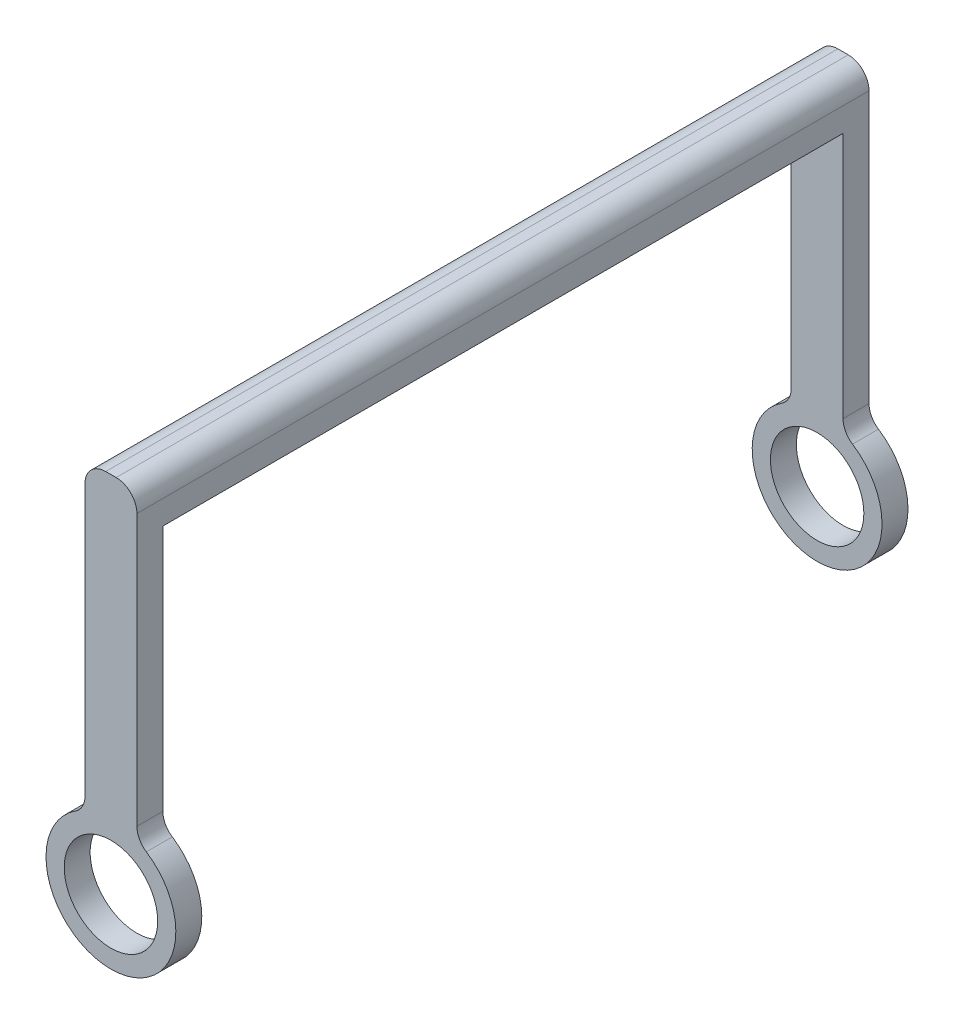
ISO-10303-21;
HEADER;
FILE_DESCRIPTION(('STEP AP214'),'2;1');
FILE_NAME('part.step','',(''),(''),'','','');
FILE_SCHEMA(('AUTOMOTIVE_DESIGN { 1 0 10303 214 1 1 1 1 }'));
ENDSEC;
DATA;
#1=APPLICATION_CONTEXT('core data for automotive mechanical design processes');
#2=APPLICATION_PROTOCOL_DEFINITION('international standard','automotive_design',2000,#1);
#3=PRODUCT_CONTEXT('',#1,'mechanical');
#4=PRODUCT('Part','Part','',(#3));
#5=PRODUCT_RELATED_PRODUCT_CATEGORY('part','',(#4));
#6=PRODUCT_DEFINITION_FORMATION('','',#4);
#7=PRODUCT_DEFINITION_CONTEXT('part definition',#1,'design');
#8=PRODUCT_DEFINITION('design','',#6,#7);
#9=PRODUCT_DEFINITION_SHAPE('','',#8);
#10=(LENGTH_UNIT() NAMED_UNIT(*) SI_UNIT(.MILLI.,.METRE.));
#11=(NAMED_UNIT(*) PLANE_ANGLE_UNIT() SI_UNIT($,.RADIAN.));
#12=(NAMED_UNIT(*) SI_UNIT($,.STERADIAN.) SOLID_ANGLE_UNIT());
#13=UNCERTAINTY_MEASURE_WITH_UNIT(LENGTH_MEASURE(1.E-05),#10,'distance_accuracy_value','');
#14=(GEOMETRIC_REPRESENTATION_CONTEXT(3) GLOBAL_UNCERTAINTY_ASSIGNED_CONTEXT((#13)) GLOBAL_UNIT_ASSIGNED_CONTEXT((#10,
#11,#12)) REPRESENTATION_CONTEXT('',''));
#15=CARTESIAN_POINT('',(0.,0.,0.));
#16=DIRECTION('',(0.,0.,1.));
#17=DIRECTION('',(1.,0.,0.));
#18=AXIS2_PLACEMENT_3D('',#15,#16,#17);
#19=CARTESIAN_POINT('',(9.,13.8293166859393,2.5));
#20=DIRECTION('',(0.,0.,1.));
#21=DIRECTION('',(1.,0.,0.));
#22=AXIS2_PLACEMENT_3D('',#19,#20,#21);
#23=PLANE('',#22);
#24=DIRECTION('',(1.,0.,0.));
#25=VECTOR('',#24,1.);
#26=CARTESIAN_POINT('',(0.,61.4013584184187,2.5));
#27=LINE('',#26,#25);
#28=CARTESIAN_POINT('',(-5.,61.4013584184187,2.5));
#29=VERTEX_POINT('',#28);
#30=CARTESIAN_POINT('',(5.,61.4013584184187,2.5));
#31=VERTEX_POINT('',#30);
#32=EDGE_CURVE('E52',#29,#31,#27,.T.);
#33=ORIENTED_EDGE('',*,*,#32,.F.);
#34=DIRECTION('',(0.,-1.,0.));
#35=VECTOR('',#34,1.);
#36=CARTESIAN_POINT('',(-5.,13.8293166859393,2.5));
#37=LINE('',#36,#35);
#38=CARTESIAN_POINT('',(-5.,13.8293166859393,2.5));
#39=VERTEX_POINT('',#38);
#40=EDGE_CURVE('E224',#29,#39,#37,.T.);
#41=ORIENTED_EDGE('',*,*,#40,.T.);
#42=CARTESIAN_POINT('',(-9.,13.8293166859393,2.5));
#43=DIRECTION('',(0.,0.,-1.));
#44=DIRECTION('',(-1.,0.,0.));
#45=AXIS2_PLACEMENT_3D('',#42,#43,#44);
#46=CIRCLE('',#45,4.);
#47=CARTESIAN_POINT('',(-6.81818181818182,10.4767550651056,2.5));
#48=VERTEX_POINT('',#47);
#49=EDGE_CURVE('E226',#39,#48,#46,.T.);
#50=ORIENTED_EDGE('',*,*,#49,.T.);
#51=CARTESIAN_POINT('',(0.,0.,2.5));
#52=DIRECTION('',(0.,0.,1.));
#53=DIRECTION('',(1.,0.,0.));
#54=AXIS2_PLACEMENT_3D('',#51,#52,#53);
#55=CIRCLE('',#54,12.5);
#56=CARTESIAN_POINT('',(6.81818181818182,10.4767550651056,2.5));
#57=VERTEX_POINT('',#56);
#58=EDGE_CURVE('E60',#48,#57,#55,.T.);
#59=ORIENTED_EDGE('',*,*,#58,.T.);
#60=CARTESIAN_POINT('',(9.,13.8293166859393,2.5));
#61=DIRECTION('',(0.,0.,-1.));
#62=DIRECTION('',(1.,0.,0.));
#63=AXIS2_PLACEMENT_3D('',#60,#61,#62);
#64=CIRCLE('',#63,4.);
#65=CARTESIAN_POINT('',(5.,13.8293166859393,2.5));
#66=VERTEX_POINT('',#65);
#67=EDGE_CURVE('E221',#57,#66,#64,.T.);
#68=ORIENTED_EDGE('',*,*,#67,.T.);
#69=DIRECTION('',(0.,1.,0.));
#70=VECTOR('',#69,1.);
#71=CARTESIAN_POINT('',(5.,13.8293166859393,2.5));
#72=LINE('',#71,#70);
#73=EDGE_CURVE('E99',#66,#31,#72,.T.);
#74=ORIENTED_EDGE('',*,*,#73,.T.);
#75=EDGE_LOOP('',(#33,#41,#50,#59,#68,#74));
#76=FACE_BOUND('',#75,.T.);
#77=CARTESIAN_POINT('',(0.,0.,2.5));
#78=DIRECTION('',(0.,0.,1.));
#79=DIRECTION('',(1.,0.,0.));
#80=AXIS2_PLACEMENT_3D('',#77,#78,#79);
#81=CIRCLE('',#80,9.);
#82=CARTESIAN_POINT('',(9.,0.,2.5));
#83=VERTEX_POINT('',#82);
#84=EDGE_CURVE('E215',#83,#83,#81,.T.);
#85=ORIENTED_EDGE('',*,*,#84,.F.);
#86=EDGE_LOOP('',(#85));
#87=FACE_BOUND('',#86,.T.);
#88=ADVANCED_FACE('F37',(#76,#87),#23,.T.);
#89=CARTESIAN_POINT('',(9.,13.8293166859393,-2.5));
#90=DIRECTION('',(0.,0.,1.));
#91=DIRECTION('',(1.,0.,0.));
#92=AXIS2_PLACEMENT_3D('',#89,#90,#91);
#93=PLANE('',#92);
#94=CARTESIAN_POINT('',(9.,13.8293166859393,-2.5));
#95=DIRECTION('',(0.,0.,-1.));
#96=DIRECTION('',(1.,0.,0.));
#97=AXIS2_PLACEMENT_3D('',#94,#95,#96);
#98=CIRCLE('',#97,4.);
#99=CARTESIAN_POINT('',(6.81818181818182,10.4767550651056,-2.5));
#100=VERTEX_POINT('',#99);
#101=CARTESIAN_POINT('',(5.,13.8293166859393,-2.5));
#102=VERTEX_POINT('',#101);
#103=EDGE_CURVE('E218',#100,#102,#98,.T.);
#104=ORIENTED_EDGE('',*,*,#103,.F.);
#105=CARTESIAN_POINT('',(0.,0.,-2.5));
#106=DIRECTION('',(0.,0.,1.));
#107=DIRECTION('',(1.,0.,0.));
#108=AXIS2_PLACEMENT_3D('',#105,#106,#107);
#109=CIRCLE('',#108,12.5);
#110=CARTESIAN_POINT('',(-6.81818181818182,10.4767550651056,-2.5));
#111=VERTEX_POINT('',#110);
#112=EDGE_CURVE('E93',#111,#100,#109,.T.);
#113=ORIENTED_EDGE('',*,*,#112,.F.);
#114=CARTESIAN_POINT('',(-9.,13.8293166859393,-2.5));
#115=DIRECTION('',(0.,0.,-1.));
#116=DIRECTION('',(-1.,0.,0.));
#117=AXIS2_PLACEMENT_3D('',#114,#115,#116);
#118=CIRCLE('',#117,4.);
#119=CARTESIAN_POINT('',(-5.,13.8293166859393,-2.5));
#120=VERTEX_POINT('',#119);
#121=EDGE_CURVE('E242',#120,#111,#118,.T.);
#122=ORIENTED_EDGE('',*,*,#121,.F.);
#123=DIRECTION('',(0.,-1.,0.));
#124=VECTOR('',#123,1.);
#125=CARTESIAN_POINT('',(-5.,13.8293166859393,-2.5));
#126=LINE('',#125,#124);
#127=CARTESIAN_POINT('',(-5.,66.,-2.5));
#128=VERTEX_POINT('',#127);
#129=EDGE_CURVE('E240',#128,#120,#126,.T.);
#130=ORIENTED_EDGE('',*,*,#129,.F.);
#131=CARTESIAN_POINT('',(-1.,66.,-2.5));
#132=DIRECTION('',(0.,0.,1.));
#133=DIRECTION('',(-1.,0.,0.));
#134=AXIS2_PLACEMENT_3D('',#131,#132,#133);
#135=CIRCLE('',#134,4.);
#136=CARTESIAN_POINT('',(-0.999999999999971,70.,-2.5));
#137=VERTEX_POINT('',#136);
#138=EDGE_CURVE('E238',#137,#128,#135,.T.);
#139=ORIENTED_EDGE('',*,*,#138,.F.);
#140=DIRECTION('',(-1.,0.,0.));
#141=VECTOR('',#140,1.);
#142=CARTESIAN_POINT('',(-0.999999999999971,70.,-2.5));
#143=LINE('',#142,#141);
#144=CARTESIAN_POINT('',(0.999999999999973,70.,-2.5));
#145=VERTEX_POINT('',#144);
#146=EDGE_CURVE('E236',#145,#137,#143,.T.);
#147=ORIENTED_EDGE('',*,*,#146,.F.);
#148=CARTESIAN_POINT('',(1.,66.,-2.5));
#149=DIRECTION('',(0.,0.,1.));
#150=DIRECTION('',(1.,0.,0.));
#151=AXIS2_PLACEMENT_3D('',#148,#149,#150);
#152=CIRCLE('',#151,4.);
#153=CARTESIAN_POINT('',(5.,66.,-2.5));
#154=VERTEX_POINT('',#153);
#155=EDGE_CURVE('E234',#154,#145,#152,.T.);
#156=ORIENTED_EDGE('',*,*,#155,.F.);
#157=DIRECTION('',(0.,1.,0.));
#158=VECTOR('',#157,1.);
#159=CARTESIAN_POINT('',(5.,13.8293166859393,-2.5));
#160=LINE('',#159,#158);
#161=EDGE_CURVE('E232',#102,#154,#160,.T.);
#162=ORIENTED_EDGE('',*,*,#161,.F.);
#163=EDGE_LOOP('',(#104,#113,#122,#130,#139,#147,#156,#162));
#164=FACE_BOUND('',#163,.T.);
#165=CARTESIAN_POINT('',(0.,0.,-2.5));
#166=DIRECTION('',(0.,0.,1.));
#167=DIRECTION('',(1.,0.,0.));
#168=AXIS2_PLACEMENT_3D('',#165,#166,#167);
#169=CIRCLE('',#168,9.);
#170=CARTESIAN_POINT('',(9.,0.,-2.5));
#171=VERTEX_POINT('',#170);
#172=EDGE_CURVE('E214',#171,#171,#169,.T.);
#173=ORIENTED_EDGE('',*,*,#172,.T.);
#174=EDGE_LOOP('',(#173));
#175=FACE_BOUND('',#174,.T.);
#176=ADVANCED_FACE('F268',(#164,#175),#93,.F.);
#177=CARTESIAN_POINT('',(9.,13.8293166859393,2.5));
#178=DIRECTION('',(0.,0.,-1.));
#179=DIRECTION('',(-1.,0.,0.));
#180=AXIS2_PLACEMENT_3D('',#177,#178,#179);
#181=CYLINDRICAL_SURFACE('',#180,4.);
#182=ORIENTED_EDGE('',*,*,#103,.T.);
#183=DIRECTION('',(0.,0.,-1.));
#184=VECTOR('',#183,1.);
#185=CARTESIAN_POINT('',(5.,13.8293166859393,2.5));
#186=LINE('',#185,#184);
#187=EDGE_CURVE('E11',#66,#102,#186,.T.);
#188=ORIENTED_EDGE('',*,*,#187,.F.);
#189=ORIENTED_EDGE('',*,*,#67,.F.);
#190=DIRECTION('',(0.,0.,-1.));
#191=VECTOR('',#190,1.);
#192=CARTESIAN_POINT('',(6.81818181818182,10.4767550651056,2.5));
#193=LINE('',#192,#191);
#194=EDGE_CURVE('E229',#57,#100,#193,.T.);
#195=ORIENTED_EDGE('',*,*,#194,.T.);
#196=EDGE_LOOP('',(#182,#188,#189,#195));
#197=FACE_BOUND('',#196,.T.);
#198=ADVANCED_FACE('F39',(#197),#181,.F.);
#199=CARTESIAN_POINT('',(5.,13.8293166859393,2.5));
#200=DIRECTION('',(-1.,0.,0.));
#201=DIRECTION('',(0.,0.,1.));
#202=AXIS2_PLACEMENT_3D('',#199,#200,#201);
#203=PLANE('',#202);
#204=ORIENTED_EDGE('',*,*,#161,.T.);
#205=DIRECTION('',(0.,0.,-1.));
#206=VECTOR('',#205,1.);
#207=CARTESIAN_POINT('',(5.,66.,2.5));
#208=LINE('',#207,#206);
#209=CARTESIAN_POINT('',(5.,66.,138.5));
#210=VERTEX_POINT('',#209);
#211=EDGE_CURVE('E45',#210,#154,#208,.T.);
#212=ORIENTED_EDGE('',*,*,#211,.F.);
#213=DIRECTION('',(0.,1.,0.));
#214=VECTOR('',#213,1.);
#215=CARTESIAN_POINT('',(5.,13.8293166859393,138.5));
#216=LINE('',#215,#214);
#217=CARTESIAN_POINT('',(5.,13.8293166859393,138.5));
#218=VERTEX_POINT('',#217);
#219=EDGE_CURVE('E169',#218,#210,#216,.T.);
#220=ORIENTED_EDGE('',*,*,#219,.F.);
#221=DIRECTION('',(0.,0.,1.));
#222=VECTOR('',#221,1.);
#223=CARTESIAN_POINT('',(5.,13.8293166859393,133.5));
#224=LINE('',#223,#222);
#225=CARTESIAN_POINT('',(5.,13.8293166859393,133.5));
#226=VERTEX_POINT('',#225);
#227=EDGE_CURVE('E180',#226,#218,#224,.T.);
#228=ORIENTED_EDGE('',*,*,#227,.F.);
#229=DIRECTION('',(0.,1.,0.));
#230=VECTOR('',#229,1.);
#231=CARTESIAN_POINT('',(5.,13.8293166859393,133.5));
#232=LINE('',#231,#230);
#233=CARTESIAN_POINT('',(5.,61.4013584184187,133.5));
#234=VERTEX_POINT('',#233);
#235=EDGE_CURVE('E168',#226,#234,#232,.T.);
#236=ORIENTED_EDGE('',*,*,#235,.T.);
#237=DIRECTION('',(0.,0.,-1.));
#238=VECTOR('',#237,1.);
#239=CARTESIAN_POINT('',(5.,61.4013584184187,133.5));
#240=LINE('',#239,#238);
#241=EDGE_CURVE('E208',#234,#31,#240,.T.);
#242=ORIENTED_EDGE('',*,*,#241,.T.);
#243=ORIENTED_EDGE('',*,*,#73,.F.);
#244=ORIENTED_EDGE('',*,*,#187,.T.);
#245=EDGE_LOOP('',(#204,#212,#220,#228,#236,#242,#243,#244));
#246=FACE_BOUND('',#245,.T.);
#247=ADVANCED_FACE('F281',(#246),#203,.F.);
#248=CARTESIAN_POINT('',(1.,66.,2.5));
#249=DIRECTION('',(0.,0.,-1.));
#250=DIRECTION('',(-1.,0.,0.));
#251=AXIS2_PLACEMENT_3D('',#248,#249,#250);
#252=CYLINDRICAL_SURFACE('',#251,4.);
#253=ORIENTED_EDGE('',*,*,#155,.T.);
#254=DIRECTION('',(0.,0.,-1.));
#255=VECTOR('',#254,1.);
#256=CARTESIAN_POINT('',(0.999999999999973,70.,2.5));
#257=LINE('',#256,#255);
#258=CARTESIAN_POINT('',(0.999999999999973,70.,138.5));
#259=VERTEX_POINT('',#258);
#260=EDGE_CURVE('E257',#259,#145,#257,.T.);
#261=ORIENTED_EDGE('',*,*,#260,.F.);
#262=CARTESIAN_POINT('',(1.,66.,138.5));
#263=DIRECTION('',(0.,0.,1.));
#264=DIRECTION('',(1.,0.,0.));
#265=AXIS2_PLACEMENT_3D('',#262,#263,#264);
#266=CIRCLE('',#265,4.);
#267=EDGE_CURVE('E197',#210,#259,#266,.T.);
#268=ORIENTED_EDGE('',*,*,#267,.F.);
#269=ORIENTED_EDGE('',*,*,#211,.T.);
#270=EDGE_LOOP('',(#253,#261,#268,#269));
#271=FACE_BOUND('',#270,.T.);
#272=ADVANCED_FACE('F263',(#271),#252,.T.);
#273=CARTESIAN_POINT('',(-0.999999999999971,70.,2.5));
#274=DIRECTION('',(0.,-1.,0.));
#275=DIRECTION('',(0.,0.,-1.));
#276=AXIS2_PLACEMENT_3D('',#273,#274,#275);
#277=PLANE('',#276);
#278=ORIENTED_EDGE('',*,*,#146,.T.);
#279=DIRECTION('',(0.,0.,-1.));
#280=VECTOR('',#279,1.);
#281=CARTESIAN_POINT('',(-0.999999999999971,70.,2.5));
#282=LINE('',#281,#280);
#283=CARTESIAN_POINT('',(-0.999999999999971,70.,138.5));
#284=VERTEX_POINT('',#283);
#285=EDGE_CURVE('E254',#284,#137,#282,.T.);
#286=ORIENTED_EDGE('',*,*,#285,.F.);
#287=DIRECTION('',(-1.,0.,0.));
#288=VECTOR('',#287,1.);
#289=CARTESIAN_POINT('',(-0.999999999999971,70.,138.5));
#290=LINE('',#289,#288);
#291=EDGE_CURVE('E194',#259,#284,#290,.T.);
#292=ORIENTED_EDGE('',*,*,#291,.F.);
#293=ORIENTED_EDGE('',*,*,#260,.T.);
#294=EDGE_LOOP('',(#278,#286,#292,#293));
#295=FACE_BOUND('',#294,.T.);
#296=ADVANCED_FACE('F273',(#295),#277,.F.);
#297=CARTESIAN_POINT('',(-1.,66.,2.5));
#298=DIRECTION('',(0.,0.,-1.));
#299=DIRECTION('',(-1.,0.,0.));
#300=AXIS2_PLACEMENT_3D('',#297,#298,#299);
#301=CYLINDRICAL_SURFACE('',#300,4.);
#302=ORIENTED_EDGE('',*,*,#138,.T.);
#303=DIRECTION('',(0.,0.,-1.));
#304=VECTOR('',#303,1.);
#305=CARTESIAN_POINT('',(-5.,66.,2.5));
#306=LINE('',#305,#304);
#307=CARTESIAN_POINT('',(-5.,66.,138.5));
#308=VERTEX_POINT('',#307);
#309=EDGE_CURVE('E251',#308,#128,#306,.T.);
#310=ORIENTED_EDGE('',*,*,#309,.F.);
#311=CARTESIAN_POINT('',(-1.,66.,138.5));
#312=DIRECTION('',(0.,0.,1.));
#313=DIRECTION('',(-1.,0.,0.));
#314=AXIS2_PLACEMENT_3D('',#311,#312,#313);
#315=CIRCLE('',#314,4.);
#316=EDGE_CURVE('E191',#284,#308,#315,.T.);
#317=ORIENTED_EDGE('',*,*,#316,.F.);
#318=ORIENTED_EDGE('',*,*,#285,.T.);
#319=EDGE_LOOP('',(#302,#310,#317,#318));
#320=FACE_BOUND('',#319,.T.);
#321=ADVANCED_FACE('F277',(#320),#301,.T.);
#322=CARTESIAN_POINT('',(-5.,13.8293166859393,2.5));
#323=DIRECTION('',(1.,0.,0.));
#324=DIRECTION('',(0.,0.,-1.));
#325=AXIS2_PLACEMENT_3D('',#322,#323,#324);
#326=PLANE('',#325);
#327=ORIENTED_EDGE('',*,*,#129,.T.);
#328=DIRECTION('',(0.,0.,-1.));
#329=VECTOR('',#328,1.);
#330=CARTESIAN_POINT('',(-5.,13.8293166859393,2.5));
#331=LINE('',#330,#329);
#332=EDGE_CURVE('E248',#39,#120,#331,.T.);
#333=ORIENTED_EDGE('',*,*,#332,.F.);
#334=ORIENTED_EDGE('',*,*,#40,.F.);
#335=DIRECTION('',(0.,0.,-1.));
#336=VECTOR('',#335,1.);
#337=CARTESIAN_POINT('',(-5.,61.4013584184187,133.5));
#338=LINE('',#337,#336);
#339=CARTESIAN_POINT('',(-5.,61.4013584184187,133.5));
#340=VERTEX_POINT('',#339);
#341=EDGE_CURVE('E211',#340,#29,#338,.T.);
#342=ORIENTED_EDGE('',*,*,#341,.F.);
#343=DIRECTION('',(0.,-1.,0.));
#344=VECTOR('',#343,1.);
#345=CARTESIAN_POINT('',(-5.,13.8293166859393,133.5));
#346=LINE('',#345,#344);
#347=CARTESIAN_POINT('',(-5.,13.8293166859393,133.5));
#348=VERTEX_POINT('',#347);
#349=EDGE_CURVE('E174',#340,#348,#346,.T.);
#350=ORIENTED_EDGE('',*,*,#349,.T.);
#351=DIRECTION('',(0.,0.,1.));
#352=VECTOR('',#351,1.);
#353=CARTESIAN_POINT('',(-5.,13.8293166859393,133.5));
#354=LINE('',#353,#352);
#355=CARTESIAN_POINT('',(-5.,13.8293166859393,138.5));
#356=VERTEX_POINT('',#355);
#357=EDGE_CURVE('E203',#348,#356,#354,.T.);
#358=ORIENTED_EDGE('',*,*,#357,.T.);
#359=DIRECTION('',(0.,-1.,0.));
#360=VECTOR('',#359,1.);
#361=CARTESIAN_POINT('',(-5.,13.8293166859393,138.5));
#362=LINE('',#361,#360);
#363=EDGE_CURVE('E188',#308,#356,#362,.T.);
#364=ORIENTED_EDGE('',*,*,#363,.F.);
#365=ORIENTED_EDGE('',*,*,#309,.T.);
#366=EDGE_LOOP('',(#327,#333,#334,#342,#350,#358,#364,#365));
#367=FACE_BOUND('',#366,.T.);
#368=ADVANCED_FACE('F287',(#367),#326,.F.);
#369=CARTESIAN_POINT('',(-9.,13.8293166859393,2.5));
#370=DIRECTION('',(0.,0.,-1.));
#371=DIRECTION('',(-1.,0.,0.));
#372=AXIS2_PLACEMENT_3D('',#369,#370,#371);
#373=CYLINDRICAL_SURFACE('',#372,4.);
#374=ORIENTED_EDGE('',*,*,#121,.T.);
#375=DIRECTION('',(0.,0.,-1.));
#376=VECTOR('',#375,1.);
#377=CARTESIAN_POINT('',(-6.81818181818182,10.4767550651056,2.5));
#378=LINE('',#377,#376);
#379=EDGE_CURVE('E246',#48,#111,#378,.T.);
#380=ORIENTED_EDGE('',*,*,#379,.F.);
#381=ORIENTED_EDGE('',*,*,#49,.F.);
#382=ORIENTED_EDGE('',*,*,#332,.T.);
#383=EDGE_LOOP('',(#374,#380,#381,#382));
#384=FACE_BOUND('',#383,.T.);
#385=ADVANCED_FACE('F295',(#384),#373,.F.);
#386=CARTESIAN_POINT('',(0.,0.,2.5));
#387=DIRECTION('',(0.,0.,-1.));
#388=DIRECTION('',(-1.,0.,0.));
#389=AXIS2_PLACEMENT_3D('',#386,#387,#388);
#390=CYLINDRICAL_SURFACE('',#389,12.5);
#391=ORIENTED_EDGE('',*,*,#112,.T.);
#392=ORIENTED_EDGE('',*,*,#194,.F.);
#393=ORIENTED_EDGE('',*,*,#58,.F.);
#394=ORIENTED_EDGE('',*,*,#379,.T.);
#395=EDGE_LOOP('',(#391,#392,#393,#394));
#396=FACE_BOUND('',#395,.T.);
#397=ADVANCED_FACE('F297',(#396),#390,.T.);
#398=CARTESIAN_POINT('',(0.,0.,2.5));
#399=DIRECTION('',(0.,0.,-1.));
#400=DIRECTION('',(-1.,0.,0.));
#401=AXIS2_PLACEMENT_3D('',#398,#399,#400);
#402=CYLINDRICAL_SURFACE('',#401,9.);
#403=ORIENTED_EDGE('',*,*,#84,.T.);
#404=EDGE_LOOP('',(#403));
#405=FACE_BOUND('',#404,.T.);
#406=ORIENTED_EDGE('',*,*,#172,.F.);
#407=EDGE_LOOP('',(#406));
#408=FACE_BOUND('',#407,.T.);
#409=ADVANCED_FACE('F306',(#405,#408),#402,.F.);
#410=CARTESIAN_POINT('',(0.,61.4013584184187,133.5));
#411=DIRECTION('',(0.,1.,0.));
#412=DIRECTION('',(-1.,0.,0.));
#413=AXIS2_PLACEMENT_3D('',#410,#411,#412);
#414=PLANE('',#413);
#415=ORIENTED_EDGE('',*,*,#32,.T.);
#416=ORIENTED_EDGE('',*,*,#241,.F.);
#417=DIRECTION('',(1.,0.,0.));
#418=VECTOR('',#417,1.);
#419=CARTESIAN_POINT('',(0.,61.4013584184187,133.5));
#420=LINE('',#419,#418);
#421=EDGE_CURVE('E206',#340,#234,#420,.T.);
#422=ORIENTED_EDGE('',*,*,#421,.F.);
#423=ORIENTED_EDGE('',*,*,#341,.T.);
#424=EDGE_LOOP('',(#415,#416,#422,#423));
#425=FACE_BOUND('',#424,.T.);
#426=ADVANCED_FACE('F283',(#425),#414,.F.);
#427=CARTESIAN_POINT('',(9.,13.8293166859393,133.5));
#428=DIRECTION('',(0.,0.,1.));
#429=DIRECTION('',(1.,0.,0.));
#430=AXIS2_PLACEMENT_3D('',#427,#428,#429);
#431=CYLINDRICAL_SURFACE('',#430,4.);
#432=CARTESIAN_POINT('',(9.,13.8293166859393,138.5));
#433=DIRECTION('',(0.,0.,-1.));
#434=DIRECTION('',(1.,0.,0.));
#435=AXIS2_PLACEMENT_3D('',#432,#433,#434);
#436=CIRCLE('',#435,4.);
#437=CARTESIAN_POINT('',(6.81818181818182,10.4767550651056,138.5));
#438=VERTEX_POINT('',#437);
#439=EDGE_CURVE('E152',#438,#218,#436,.T.);
#440=ORIENTED_EDGE('',*,*,#439,.F.);
#441=DIRECTION('',(0.,0.,1.));
#442=VECTOR('',#441,1.);
#443=CARTESIAN_POINT('',(6.81818181818182,10.4767550651056,133.5));
#444=LINE('',#443,#442);
#445=CARTESIAN_POINT('',(6.81818181818182,10.4767550651056,133.5));
#446=VERTEX_POINT('',#445);
#447=EDGE_CURVE('E146',#446,#438,#444,.T.);
#448=ORIENTED_EDGE('',*,*,#447,.F.);
#449=CARTESIAN_POINT('',(9.,13.8293166859393,133.5));
#450=DIRECTION('',(0.,0.,-1.));
#451=DIRECTION('',(1.,0.,0.));
#452=AXIS2_PLACEMENT_3D('',#449,#450,#451);
#453=CIRCLE('',#452,4.);
#454=EDGE_CURVE('E149',#446,#226,#453,.T.);
#455=ORIENTED_EDGE('',*,*,#454,.T.);
#456=ORIENTED_EDGE('',*,*,#227,.T.);
#457=EDGE_LOOP('',(#440,#448,#455,#456));
#458=FACE_BOUND('',#457,.T.);
#459=ADVANCED_FACE('F148',(#458),#431,.F.);
#460=CARTESIAN_POINT('',(0.,0.,133.5));
#461=DIRECTION('',(0.,0.,1.));
#462=DIRECTION('',(1.,0.,0.));
#463=AXIS2_PLACEMENT_3D('',#460,#461,#462);
#464=CYLINDRICAL_SURFACE('',#463,12.5);
#465=CARTESIAN_POINT('',(0.,0.,138.5));
#466=DIRECTION('',(0.,0.,1.));
#467=DIRECTION('',(1.,0.,0.));
#468=AXIS2_PLACEMENT_3D('',#465,#466,#467);
#469=CIRCLE('',#468,12.5);
#470=CARTESIAN_POINT('',(-6.81818181818182,10.4767550651056,138.5));
#471=VERTEX_POINT('',#470);
#472=EDGE_CURVE('E182',#471,#438,#469,.T.);
#473=ORIENTED_EDGE('',*,*,#472,.F.);
#474=DIRECTION('',(0.,0.,1.));
#475=VECTOR('',#474,1.);
#476=CARTESIAN_POINT('',(-6.81818181818182,10.4767550651056,133.5));
#477=LINE('',#476,#475);
#478=CARTESIAN_POINT('',(-6.81818181818182,10.4767550651056,133.5));
#479=VERTEX_POINT('',#478);
#480=EDGE_CURVE('E157',#479,#471,#477,.T.);
#481=ORIENTED_EDGE('',*,*,#480,.F.);
#482=CARTESIAN_POINT('',(0.,0.,133.5));
#483=DIRECTION('',(0.,0.,1.));
#484=DIRECTION('',(1.,0.,0.));
#485=AXIS2_PLACEMENT_3D('',#482,#483,#484);
#486=CIRCLE('',#485,12.5);
#487=EDGE_CURVE('E164',#479,#446,#486,.T.);
#488=ORIENTED_EDGE('',*,*,#487,.T.);
#489=ORIENTED_EDGE('',*,*,#447,.T.);
#490=EDGE_LOOP('',(#473,#481,#488,#489));
#491=FACE_BOUND('',#490,.T.);
#492=ADVANCED_FACE('F171',(#491),#464,.T.);
#493=CARTESIAN_POINT('',(-9.,13.8293166859393,133.5));
#494=DIRECTION('',(0.,0.,1.));
#495=DIRECTION('',(1.,0.,0.));
#496=AXIS2_PLACEMENT_3D('',#493,#494,#495);
#497=CYLINDRICAL_SURFACE('',#496,4.);
#498=CARTESIAN_POINT('',(-9.,13.8293166859393,138.5));
#499=DIRECTION('',(0.,0.,-1.));
#500=DIRECTION('',(-1.,0.,0.));
#501=AXIS2_PLACEMENT_3D('',#498,#499,#500);
#502=CIRCLE('',#501,4.);
#503=EDGE_CURVE('E185',#356,#471,#502,.T.);
#504=ORIENTED_EDGE('',*,*,#503,.F.);
#505=ORIENTED_EDGE('',*,*,#357,.F.);
#506=CARTESIAN_POINT('',(-9.,13.8293166859393,133.5));
#507=DIRECTION('',(0.,0.,-1.));
#508=DIRECTION('',(-1.,0.,0.));
#509=AXIS2_PLACEMENT_3D('',#506,#507,#508);
#510=CIRCLE('',#509,4.);
#511=EDGE_CURVE('E172',#348,#479,#510,.T.);
#512=ORIENTED_EDGE('',*,*,#511,.T.);
#513=ORIENTED_EDGE('',*,*,#480,.T.);
#514=EDGE_LOOP('',(#504,#505,#512,#513));
#515=FACE_BOUND('',#514,.T.);
#516=ADVANCED_FACE('F290',(#515),#497,.F.);
#517=CARTESIAN_POINT('',(9.,13.8293166859393,133.5));
#518=DIRECTION('',(0.,0.,-1.));
#519=DIRECTION('',(1.,0.,0.));
#520=AXIS2_PLACEMENT_3D('',#517,#518,#519);
#521=PLANE('',#520);
#522=CARTESIAN_POINT('',(0.,0.,133.5));
#523=DIRECTION('',(0.,0.,1.));
#524=DIRECTION('',(1.,0.,0.));
#525=AXIS2_PLACEMENT_3D('',#522,#523,#524);
#526=CIRCLE('',#525,9.);
#527=CARTESIAN_POINT('',(9.,0.,133.5));
#528=VERTEX_POINT('',#527);
#529=EDGE_CURVE('E183',#528,#528,#526,.T.);
#530=ORIENTED_EDGE('',*,*,#529,.T.);
#531=EDGE_LOOP('',(#530));
#532=FACE_BOUND('',#531,.T.);
#533=ORIENTED_EDGE('',*,*,#349,.F.);
#534=ORIENTED_EDGE('',*,*,#421,.T.);
#535=ORIENTED_EDGE('',*,*,#235,.F.);
#536=ORIENTED_EDGE('',*,*,#454,.F.);
#537=ORIENTED_EDGE('',*,*,#487,.F.);
#538=ORIENTED_EDGE('',*,*,#511,.F.);
#539=EDGE_LOOP('',(#533,#534,#535,#536,#537,#538));
#540=FACE_BOUND('',#539,.T.);
#541=ADVANCED_FACE('F162',(#532,#540),#521,.T.);
#542=CARTESIAN_POINT('',(9.,13.8293166859393,138.5));
#543=DIRECTION('',(0.,0.,-1.));
#544=DIRECTION('',(1.,0.,0.));
#545=AXIS2_PLACEMENT_3D('',#542,#543,#544);
#546=PLANE('',#545);
#547=CARTESIAN_POINT('',(0.,0.,138.5));
#548=DIRECTION('',(0.,0.,1.));
#549=DIRECTION('',(1.,0.,0.));
#550=AXIS2_PLACEMENT_3D('',#547,#548,#549);
#551=CIRCLE('',#550,9.);
#552=CARTESIAN_POINT('',(9.,0.,138.5));
#553=VERTEX_POINT('',#552);
#554=EDGE_CURVE('E503',#553,#553,#551,.T.);
#555=ORIENTED_EDGE('',*,*,#554,.F.);
#556=EDGE_LOOP('',(#555));
#557=FACE_BOUND('',#556,.T.);
#558=ORIENTED_EDGE('',*,*,#439,.T.);
#559=ORIENTED_EDGE('',*,*,#219,.T.);
#560=ORIENTED_EDGE('',*,*,#267,.T.);
#561=ORIENTED_EDGE('',*,*,#291,.T.);
#562=ORIENTED_EDGE('',*,*,#316,.T.);
#563=ORIENTED_EDGE('',*,*,#363,.T.);
#564=ORIENTED_EDGE('',*,*,#503,.T.);
#565=ORIENTED_EDGE('',*,*,#472,.T.);
#566=EDGE_LOOP('',(#558,#559,#560,#561,#562,#563,#564,#565));
#567=FACE_BOUND('',#566,.T.);
#568=ADVANCED_FACE('F280',(#557,#567),#546,.F.);
#569=CARTESIAN_POINT('',(0.,0.,133.5));
#570=DIRECTION('',(0.,0.,1.));
#571=DIRECTION('',(1.,0.,0.));
#572=AXIS2_PLACEMENT_3D('',#569,#570,#571);
#573=CYLINDRICAL_SURFACE('',#572,9.);
#574=ORIENTED_EDGE('',*,*,#529,.F.);
#575=EDGE_LOOP('',(#574));
#576=FACE_BOUND('',#575,.T.);
#577=ORIENTED_EDGE('',*,*,#554,.T.);
#578=EDGE_LOOP('',(#577));
#579=FACE_BOUND('',#578,.T.);
#580=ADVANCED_FACE('F387',(#576,#579),#573,.F.);
#581=CLOSED_SHELL('',(#88,#176,#198,#247,#272,#296,#321,#368,#385,#397,#409,#426,#459,#492,#516,
#541,#568,#580));
#582=MANIFOLD_SOLID_BREP('B2',#581);
#583=ADVANCED_BREP_SHAPE_REPRESENTATION('',(#18,#582),#14);
#584=SHAPE_DEFINITION_REPRESENTATION(#9,#583);
ENDSEC;
END-ISO-10303-21;
